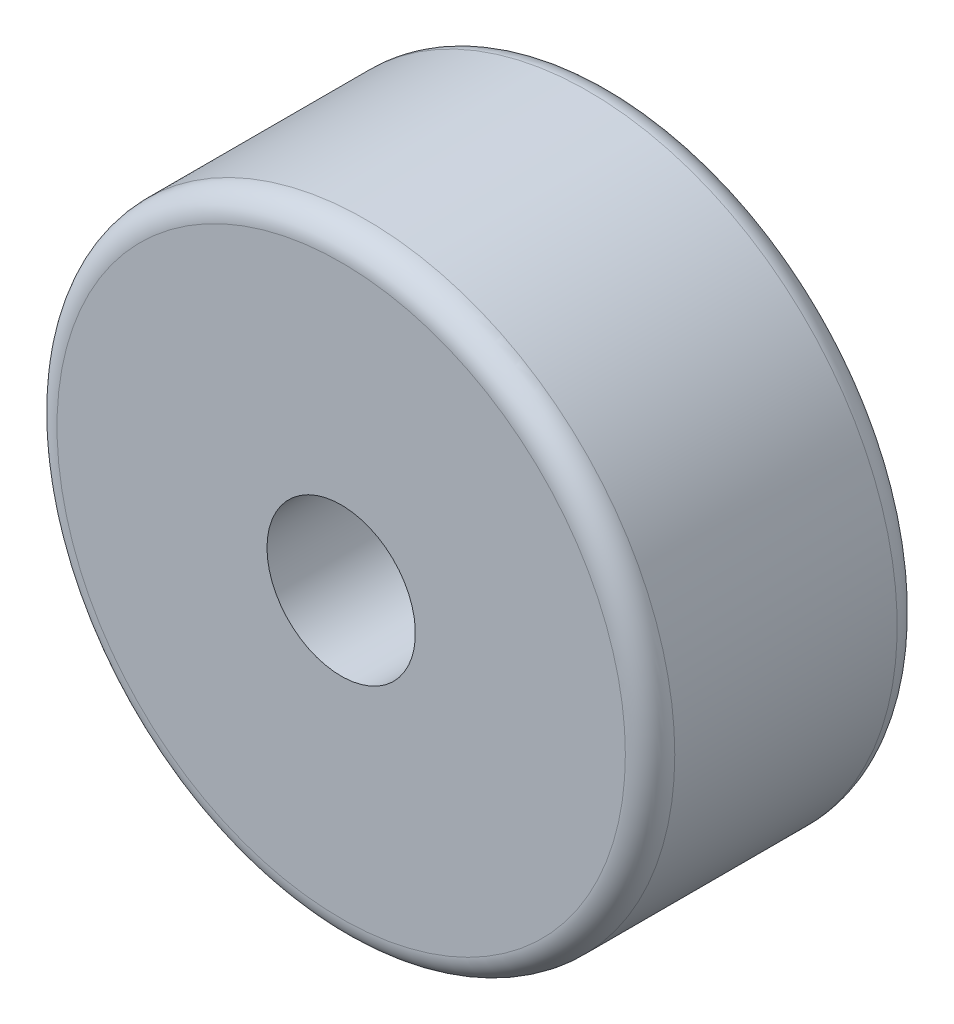
ISO-10303-21;
HEADER;
FILE_DESCRIPTION(('STEP AP214'),'2;1');
FILE_NAME('part.step','',(''),(''),'','','');
FILE_SCHEMA(('AUTOMOTIVE_DESIGN { 1 0 10303 214 1 1 1 1 }'));
ENDSEC;
DATA;
#1=APPLICATION_CONTEXT('core data for automotive mechanical design processes');
#2=APPLICATION_PROTOCOL_DEFINITION('international standard','automotive_design',2000,#1);
#3=PRODUCT_CONTEXT('',#1,'mechanical');
#4=PRODUCT('Part','Part','',(#3));
#5=PRODUCT_RELATED_PRODUCT_CATEGORY('part','',(#4));
#6=PRODUCT_DEFINITION_FORMATION('','',#4);
#7=PRODUCT_DEFINITION_CONTEXT('part definition',#1,'design');
#8=PRODUCT_DEFINITION('design','',#6,#7);
#9=PRODUCT_DEFINITION_SHAPE('','',#8);
#10=(LENGTH_UNIT() NAMED_UNIT(*) SI_UNIT(.MILLI.,.METRE.));
#11=(NAMED_UNIT(*) PLANE_ANGLE_UNIT() SI_UNIT($,.RADIAN.));
#12=(NAMED_UNIT(*) SI_UNIT($,.STERADIAN.) SOLID_ANGLE_UNIT());
#13=UNCERTAINTY_MEASURE_WITH_UNIT(LENGTH_MEASURE(1.E-05),#10,'distance_accuracy_value','');
#14=(GEOMETRIC_REPRESENTATION_CONTEXT(3) GLOBAL_UNCERTAINTY_ASSIGNED_CONTEXT((#13)) GLOBAL_UNIT_ASSIGNED_CONTEXT((#10,
#11,#12)) REPRESENTATION_CONTEXT('',''));
#15=CARTESIAN_POINT('',(0.,0.,0.));
#16=DIRECTION('',(0.,0.,1.));
#17=DIRECTION('',(1.,0.,0.));
#18=AXIS2_PLACEMENT_3D('',#15,#16,#17);
#19=CARTESIAN_POINT('',(0.,0.,0.));
#20=DIRECTION('',(0.,0.,-1.));
#21=DIRECTION('',(-1.,0.,0.));
#22=AXIS2_PLACEMENT_3D('',#19,#20,#21);
#23=CYLINDRICAL_SURFACE('',#22,15.2527);
#24=CARTESIAN_POINT('',(0.,0.,-27.94));
#25=DIRECTION('',(0.,0.,-1.));
#26=DIRECTION('',(-1.,0.,0.));
#27=AXIS2_PLACEMENT_3D('',#24,#25,#26);
#28=CIRCLE('',#27,15.2527);
#29=CARTESIAN_POINT('',(-15.2527,0.,-27.94));
#30=VERTEX_POINT('',#29);
#31=EDGE_CURVE('E55',#30,#30,#28,.T.);
#32=ORIENTED_EDGE('',*,*,#31,.T.);
#33=EDGE_LOOP('',(#32));
#34=FACE_BOUND('',#33,.T.);
#35=CARTESIAN_POINT('',(0.,0.,27.94));
#36=DIRECTION('',(0.,0.,-1.));
#37=DIRECTION('',(-1.,0.,0.));
#38=AXIS2_PLACEMENT_3D('',#35,#36,#37);
#39=CIRCLE('',#38,15.2527);
#40=CARTESIAN_POINT('',(-15.2527,0.,27.94));
#41=VERTEX_POINT('',#40);
#42=EDGE_CURVE('E52',#41,#41,#39,.T.);
#43=ORIENTED_EDGE('',*,*,#42,.F.);
#44=EDGE_LOOP('',(#43));
#45=FACE_BOUND('',#44,.T.);
#46=ADVANCED_FACE('F32',(#34,#45),#23,.F.);
#47=CARTESIAN_POINT('',(0.,15.2527,27.94));
#48=DIRECTION('',(0.,0.,1.));
#49=DIRECTION('',(1.,0.,0.));
#50=AXIS2_PLACEMENT_3D('',#47,#48,#49);
#51=PLANE('',#50);
#52=CARTESIAN_POINT('',(0.,0.,27.94));
#53=DIRECTION('',(0.,0.,1.));
#54=DIRECTION('',(1.,0.,0.));
#55=AXIS2_PLACEMENT_3D('',#52,#53,#54);
#56=CIRCLE('',#55,58.42);
#57=CARTESIAN_POINT('',(58.42,0.,27.94));
#58=VERTEX_POINT('',#57);
#59=EDGE_CURVE('E10',#58,#58,#56,.T.);
#60=ORIENTED_EDGE('',*,*,#59,.T.);
#61=EDGE_LOOP('',(#60));
#62=FACE_BOUND('',#61,.T.);
#63=ORIENTED_EDGE('',*,*,#42,.T.);
#64=EDGE_LOOP('',(#63));
#65=FACE_BOUND('',#64,.T.);
#66=ADVANCED_FACE('F72',(#62,#65),#51,.T.);
#67=CARTESIAN_POINT('',(0.,0.,0.));
#68=DIRECTION('',(0.,0.,-1.));
#69=DIRECTION('',(-1.,0.,0.));
#70=AXIS2_PLACEMENT_3D('',#67,#68,#69);
#71=CYLINDRICAL_SURFACE('',#70,63.5);
#72=CARTESIAN_POINT('',(0.,0.,-22.86));
#73=DIRECTION('',(0.,0.,-1.));
#74=DIRECTION('',(-1.,0.,0.));
#75=AXIS2_PLACEMENT_3D('',#72,#73,#74);
#76=CIRCLE('',#75,63.5);
#77=CARTESIAN_POINT('',(-63.5,0.,-22.86));
#78=VERTEX_POINT('',#77);
#79=EDGE_CURVE('E39',#78,#78,#76,.F.);
#80=ORIENTED_EDGE('',*,*,#79,.T.);
#81=EDGE_LOOP('',(#80));
#82=FACE_BOUND('',#81,.T.);
#83=CARTESIAN_POINT('',(0.,0.,22.86));
#84=DIRECTION('',(0.,0.,1.));
#85=DIRECTION('',(1.,0.,0.));
#86=AXIS2_PLACEMENT_3D('',#83,#84,#85);
#87=CIRCLE('',#86,63.5);
#88=CARTESIAN_POINT('',(63.5,0.,22.86));
#89=VERTEX_POINT('',#88);
#90=EDGE_CURVE('E43',#89,#89,#87,.F.);
#91=ORIENTED_EDGE('',*,*,#90,.T.);
#92=EDGE_LOOP('',(#91));
#93=FACE_BOUND('',#92,.T.);
#94=ADVANCED_FACE('F64',(#82,#93),#71,.T.);
#95=CARTESIAN_POINT('',(0.,63.5,-27.94));
#96=DIRECTION('',(0.,0.,-1.));
#97=DIRECTION('',(-1.,0.,0.));
#98=AXIS2_PLACEMENT_3D('',#95,#96,#97);
#99=PLANE('',#98);
#100=CARTESIAN_POINT('',(0.,0.,-27.94));
#101=DIRECTION('',(0.,0.,-1.));
#102=DIRECTION('',(-1.,0.,0.));
#103=AXIS2_PLACEMENT_3D('',#100,#101,#102);
#104=CIRCLE('',#103,58.42);
#105=CARTESIAN_POINT('',(-58.42,0.,-27.94));
#106=VERTEX_POINT('',#105);
#107=EDGE_CURVE('E47',#106,#106,#104,.T.);
#108=ORIENTED_EDGE('',*,*,#107,.T.);
#109=EDGE_LOOP('',(#108));
#110=FACE_BOUND('',#109,.T.);
#111=ORIENTED_EDGE('',*,*,#31,.F.);
#112=EDGE_LOOP('',(#111));
#113=FACE_BOUND('',#112,.T.);
#114=ADVANCED_FACE('F61',(#110,#113),#99,.T.);
#115=CARTESIAN_POINT('',(0.,0.,-22.86));
#116=DIRECTION('',(0.,0.,-1.));
#117=DIRECTION('',(-1.,0.,0.));
#118=AXIS2_PLACEMENT_3D('',#115,#116,#117);
#119=TOROIDAL_SURFACE('',#118,58.42,5.08);
#120=ORIENTED_EDGE('',*,*,#79,.F.);
#121=EDGE_LOOP('',(#120));
#122=FACE_BOUND('',#121,.T.);
#123=ORIENTED_EDGE('',*,*,#107,.F.);
#124=EDGE_LOOP('',(#123));
#125=FACE_BOUND('',#124,.T.);
#126=ADVANCED_FACE('F63',(#122,#125),#119,.T.);
#127=CARTESIAN_POINT('',(0.,0.,22.86));
#128=DIRECTION('',(0.,0.,1.));
#129=DIRECTION('',(1.,0.,0.));
#130=AXIS2_PLACEMENT_3D('',#127,#128,#129);
#131=TOROIDAL_SURFACE('',#130,58.42,5.08);
#132=ORIENTED_EDGE('',*,*,#59,.F.);
#133=EDGE_LOOP('',(#132));
#134=FACE_BOUND('',#133,.T.);
#135=ORIENTED_EDGE('',*,*,#90,.F.);
#136=EDGE_LOOP('',(#135));
#137=FACE_BOUND('',#136,.T.);
#138=ADVANCED_FACE('F34',(#134,#137),#131,.T.);
#139=CLOSED_SHELL('',(#46,#66,#94,#114,#126,#138));
#140=MANIFOLD_SOLID_BREP('B2',#139);
#141=ADVANCED_BREP_SHAPE_REPRESENTATION('',(#18,#140),#14);
#142=SHAPE_DEFINITION_REPRESENTATION(#9,#141);
ENDSEC;
END-ISO-10303-21;
